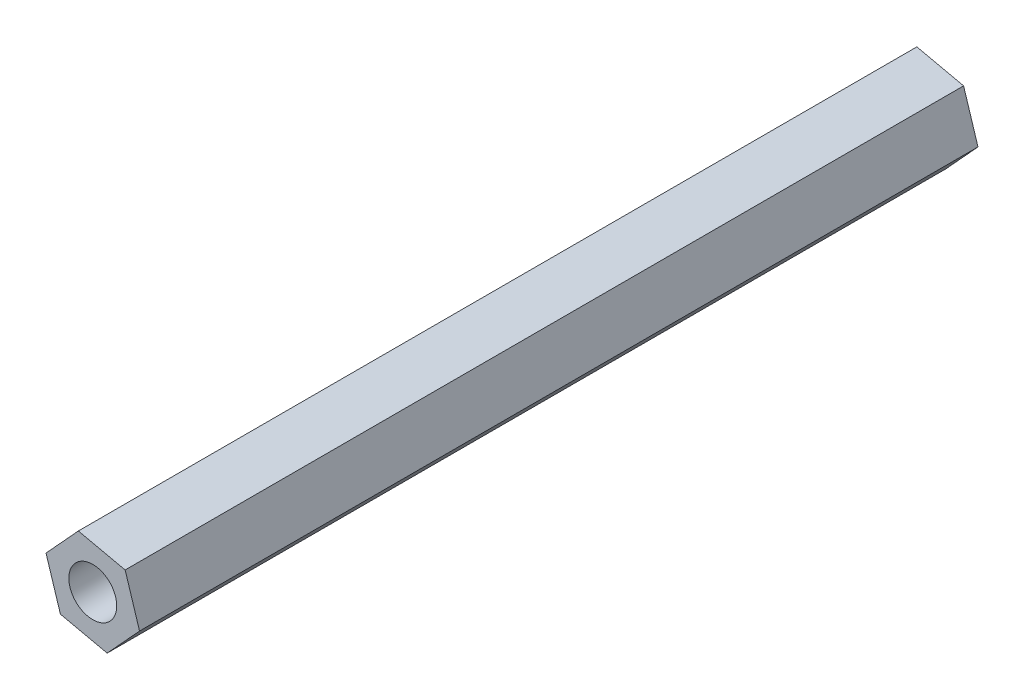
ISO-10303-21;
HEADER;
FILE_DESCRIPTION(('STEP AP214'),'2;1');
FILE_NAME('part.step','',(''),(''),'','','');
FILE_SCHEMA(('AUTOMOTIVE_DESIGN { 1 0 10303 214 1 1 1 1 }'));
ENDSEC;
DATA;
#1=APPLICATION_CONTEXT('core data for automotive mechanical design processes');
#2=APPLICATION_PROTOCOL_DEFINITION('international standard','automotive_design',2000,#1);
#3=PRODUCT_CONTEXT('',#1,'mechanical');
#4=PRODUCT('Part','Part','',(#3));
#5=PRODUCT_RELATED_PRODUCT_CATEGORY('part','',(#4));
#6=PRODUCT_DEFINITION_FORMATION('','',#4);
#7=PRODUCT_DEFINITION_CONTEXT('part definition',#1,'design');
#8=PRODUCT_DEFINITION('design','',#6,#7);
#9=PRODUCT_DEFINITION_SHAPE('','',#8);
#10=(LENGTH_UNIT() NAMED_UNIT(*) SI_UNIT(.MILLI.,.METRE.));
#11=(NAMED_UNIT(*) PLANE_ANGLE_UNIT() SI_UNIT($,.RADIAN.));
#12=(NAMED_UNIT(*) SI_UNIT($,.STERADIAN.) SOLID_ANGLE_UNIT());
#13=UNCERTAINTY_MEASURE_WITH_UNIT(LENGTH_MEASURE(1.E-05),#10,'distance_accuracy_value','');
#14=(GEOMETRIC_REPRESENTATION_CONTEXT(3) GLOBAL_UNCERTAINTY_ASSIGNED_CONTEXT((#13)) GLOBAL_UNIT_ASSIGNED_CONTEXT((#10,
#11,#12)) REPRESENTATION_CONTEXT('',''));
#15=CARTESIAN_POINT('',(0.,0.,0.));
#16=DIRECTION('',(0.,0.,1.));
#17=DIRECTION('',(1.,0.,0.));
#18=AXIS2_PLACEMENT_3D('',#15,#16,#17);
#19=CARTESIAN_POINT('',(0.,0.,70.));
#20=DIRECTION('',(0.,0.,1.));
#21=DIRECTION('',(1.,0.,0.));
#22=AXIS2_PLACEMENT_3D('',#19,#20,#21);
#23=PLANE('',#22);
#24=DIRECTION('',(-0.976282323244867,0.216501328678612,0.));
#25=VECTOR('',#24,1.);
#26=CARTESIAN_POINT('',(-150.297452748808,45.2139385154254,70.));
#27=LINE('',#26,#25);
#28=CARTESIAN_POINT('',(-150.297452748808,45.2139385154254,70.));
#29=VERTEX_POINT('',#28);
#30=CARTESIAN_POINT('',(-154.202582041788,46.0799438301398,70.));
#31=VERTEX_POINT('',#30);
#32=EDGE_CURVE('E143',#29,#31,#27,.T.);
#33=ORIENTED_EDGE('',*,*,#32,.T.);
#34=DIRECTION('',(-0.675636812211194,-0.737234628856442,0.));
#35=VECTOR('',#34,1.);
#36=CARTESIAN_POINT('',(-154.202582041788,46.0799438301398,70.));
#37=LINE('',#36,#35);
#38=CARTESIAN_POINT('',(-156.905129290632,43.1310053147141,70.));
#39=VERTEX_POINT('',#38);
#40=EDGE_CURVE('E101',#31,#39,#37,.T.);
#41=ORIENTED_EDGE('',*,*,#40,.T.);
#42=DIRECTION('',(0.300645511033671,-0.953735957535052,0.));
#43=VECTOR('',#42,1.);
#44=CARTESIAN_POINT('',(-156.905129290632,43.1310053147141,70.));
#45=LINE('',#44,#43);
#46=CARTESIAN_POINT('',(-155.702547246498,39.3160614845739,70.));
#47=VERTEX_POINT('',#46);
#48=EDGE_CURVE('E114',#39,#47,#45,.T.);
#49=ORIENTED_EDGE('',*,*,#48,.T.);
#50=DIRECTION('',(0.976282323244867,-0.216501328678614,0.));
#51=VECTOR('',#50,1.);
#52=CARTESIAN_POINT('',(-155.702547246498,39.3160614845739,70.));
#53=LINE('',#52,#51);
#54=CARTESIAN_POINT('',(-151.797417953518,38.4500561698594,70.));
#55=VERTEX_POINT('',#54);
#56=EDGE_CURVE('E108',#47,#55,#53,.T.);
#57=ORIENTED_EDGE('',*,*,#56,.T.);
#58=DIRECTION('',(0.675636812211199,0.737234628856438,0.));
#59=VECTOR('',#58,1.);
#60=CARTESIAN_POINT('',(-151.797417953518,38.4500561698594,70.));
#61=LINE('',#60,#59);
#62=CARTESIAN_POINT('',(-149.094870704673,41.3989946852852,70.));
#63=VERTEX_POINT('',#62);
#64=EDGE_CURVE('E112',#55,#63,#61,.T.);
#65=ORIENTED_EDGE('',*,*,#64,.T.);
#66=DIRECTION('',(-0.30064551103367,0.953735957535052,0.));
#67=VECTOR('',#66,1.);
#68=CARTESIAN_POINT('',(-149.094870704673,41.3989946852852,70.));
#69=LINE('',#68,#67);
#70=EDGE_CURVE('E64',#63,#29,#69,.T.);
#71=ORIENTED_EDGE('',*,*,#70,.T.);
#72=EDGE_LOOP('',(#33,#41,#49,#57,#65,#71));
#73=FACE_BOUND('',#72,.T.);
#74=CARTESIAN_POINT('',(-152.999999997653,42.2649999999996,70.));
#75=DIRECTION('',(0.,0.,1.));
#76=DIRECTION('',(1.,0.,0.));
#77=AXIS2_PLACEMENT_3D('',#74,#75,#76);
#78=CIRCLE('',#77,2.);
#79=CARTESIAN_POINT('',(-150.999999997653,42.2649999999996,70.));
#80=VERTEX_POINT('',#79);
#81=EDGE_CURVE('E136',#80,#80,#78,.T.);
#82=ORIENTED_EDGE('',*,*,#81,.F.);
#83=EDGE_LOOP('',(#82));
#84=FACE_BOUND('',#83,.T.);
#85=ADVANCED_FACE('F47',(#73,#84),#23,.T.);
#86=CARTESIAN_POINT('',(0.,0.,0.));
#87=DIRECTION('',(0.,0.,1.));
#88=DIRECTION('',(1.,0.,0.));
#89=AXIS2_PLACEMENT_3D('',#86,#87,#88);
#90=PLANE('',#89);
#91=DIRECTION('',(-0.976282323244867,0.216501328678612,0.));
#92=VECTOR('',#91,1.);
#93=CARTESIAN_POINT('',(-150.297452748808,45.2139385154254,0.));
#94=LINE('',#93,#92);
#95=CARTESIAN_POINT('',(-150.297452748808,45.2139385154254,0.));
#96=VERTEX_POINT('',#95);
#97=CARTESIAN_POINT('',(-154.202582041788,46.0799438301398,0.));
#98=VERTEX_POINT('',#97);
#99=EDGE_CURVE('E132',#96,#98,#94,.T.);
#100=ORIENTED_EDGE('',*,*,#99,.F.);
#101=DIRECTION('',(-0.30064551103367,0.953735957535052,0.));
#102=VECTOR('',#101,1.);
#103=CARTESIAN_POINT('',(-149.094870704673,41.3989946852852,0.));
#104=LINE('',#103,#102);
#105=CARTESIAN_POINT('',(-149.094870704673,41.3989946852852,0.));
#106=VERTEX_POINT('',#105);
#107=EDGE_CURVE('E93',#106,#96,#104,.T.);
#108=ORIENTED_EDGE('',*,*,#107,.F.);
#109=DIRECTION('',(0.675636812211199,0.737234628856438,0.));
#110=VECTOR('',#109,1.);
#111=CARTESIAN_POINT('',(-151.797417953518,38.4500561698594,0.));
#112=LINE('',#111,#110);
#113=CARTESIAN_POINT('',(-151.797417953518,38.4500561698594,0.));
#114=VERTEX_POINT('',#113);
#115=EDGE_CURVE('E87',#114,#106,#112,.T.);
#116=ORIENTED_EDGE('',*,*,#115,.F.);
#117=DIRECTION('',(0.976282323244867,-0.216501328678614,0.));
#118=VECTOR('',#117,1.);
#119=CARTESIAN_POINT('',(-155.702547246498,39.3160614845739,0.));
#120=LINE('',#119,#118);
#121=CARTESIAN_POINT('',(-155.702547246498,39.3160614845739,0.));
#122=VERTEX_POINT('',#121);
#123=EDGE_CURVE('E122',#122,#114,#120,.T.);
#124=ORIENTED_EDGE('',*,*,#123,.F.);
#125=DIRECTION('',(0.300645511033671,-0.953735957535052,0.));
#126=VECTOR('',#125,1.);
#127=CARTESIAN_POINT('',(-156.905129290632,43.1310053147141,0.));
#128=LINE('',#127,#126);
#129=CARTESIAN_POINT('',(-156.905129290632,43.1310053147141,0.));
#130=VERTEX_POINT('',#129);
#131=EDGE_CURVE('E138',#130,#122,#128,.T.);
#132=ORIENTED_EDGE('',*,*,#131,.F.);
#133=DIRECTION('',(-0.675636812211194,-0.737234628856442,0.));
#134=VECTOR('',#133,1.);
#135=CARTESIAN_POINT('',(-154.202582041788,46.0799438301398,0.));
#136=LINE('',#135,#134);
#137=EDGE_CURVE('E135',#98,#130,#136,.T.);
#138=ORIENTED_EDGE('',*,*,#137,.F.);
#139=EDGE_LOOP('',(#100,#108,#116,#124,#132,#138));
#140=FACE_BOUND('',#139,.T.);
#141=CARTESIAN_POINT('',(-152.999999997653,42.2649999999996,0.));
#142=DIRECTION('',(0.,0.,1.));
#143=DIRECTION('',(1.,0.,0.));
#144=AXIS2_PLACEMENT_3D('',#141,#142,#143);
#145=CIRCLE('',#144,2.);
#146=CARTESIAN_POINT('',(-150.999999997653,42.2649999999996,0.));
#147=VERTEX_POINT('',#146);
#148=EDGE_CURVE('E245',#147,#147,#145,.T.);
#149=ORIENTED_EDGE('',*,*,#148,.T.);
#150=EDGE_LOOP('',(#149));
#151=FACE_BOUND('',#150,.T.);
#152=ADVANCED_FACE('F152',(#140,#151),#90,.F.);
#153=CARTESIAN_POINT('',(-150.297452748808,45.2139385154254,70.));
#154=DIRECTION('',(-0.216501328678612,-0.976282323244867,0.));
#155=DIRECTION('',(0.976282323244867,-0.216501328678612,0.));
#156=AXIS2_PLACEMENT_3D('',#153,#154,#155);
#157=PLANE('',#156);
#158=ORIENTED_EDGE('',*,*,#99,.T.);
#159=DIRECTION('',(0.,0.,-1.));
#160=VECTOR('',#159,1.);
#161=CARTESIAN_POINT('',(-154.202582041788,46.0799438301398,70.));
#162=LINE('',#161,#160);
#163=EDGE_CURVE('E13',#31,#98,#162,.T.);
#164=ORIENTED_EDGE('',*,*,#163,.F.);
#165=ORIENTED_EDGE('',*,*,#32,.F.);
#166=DIRECTION('',(0.,0.,-1.));
#167=VECTOR('',#166,1.);
#168=CARTESIAN_POINT('',(-150.297452748808,45.2139385154254,70.));
#169=LINE('',#168,#167);
#170=EDGE_CURVE('E128',#29,#96,#169,.T.);
#171=ORIENTED_EDGE('',*,*,#170,.T.);
#172=EDGE_LOOP('',(#158,#164,#165,#171));
#173=FACE_BOUND('',#172,.T.);
#174=ADVANCED_FACE('F49',(#173),#157,.F.);
#175=CARTESIAN_POINT('',(-154.202582041788,46.0799438301398,70.));
#176=DIRECTION('',(0.737234628856442,-0.675636812211194,0.));
#177=DIRECTION('',(0.675636812211194,0.737234628856442,0.));
#178=AXIS2_PLACEMENT_3D('',#175,#176,#177);
#179=PLANE('',#178);
#180=ORIENTED_EDGE('',*,*,#137,.T.);
#181=DIRECTION('',(0.,0.,-1.));
#182=VECTOR('',#181,1.);
#183=CARTESIAN_POINT('',(-156.905129290632,43.1310053147141,70.));
#184=LINE('',#183,#182);
#185=EDGE_CURVE('E56',#39,#130,#184,.T.);
#186=ORIENTED_EDGE('',*,*,#185,.F.);
#187=ORIENTED_EDGE('',*,*,#40,.F.);
#188=ORIENTED_EDGE('',*,*,#163,.T.);
#189=EDGE_LOOP('',(#180,#186,#187,#188));
#190=FACE_BOUND('',#189,.T.);
#191=ADVANCED_FACE('F177',(#190),#179,.F.);
#192=CARTESIAN_POINT('',(-156.905129290632,43.1310053147141,70.));
#193=DIRECTION('',(0.953735957535052,0.300645511033671,0.));
#194=DIRECTION('',(-0.300645511033671,0.953735957535052,0.));
#195=AXIS2_PLACEMENT_3D('',#192,#193,#194);
#196=PLANE('',#195);
#197=ORIENTED_EDGE('',*,*,#131,.T.);
#198=DIRECTION('',(0.,0.,-1.));
#199=VECTOR('',#198,1.);
#200=CARTESIAN_POINT('',(-155.702547246498,39.3160614845739,70.));
#201=LINE('',#200,#199);
#202=EDGE_CURVE('E123',#47,#122,#201,.T.);
#203=ORIENTED_EDGE('',*,*,#202,.F.);
#204=ORIENTED_EDGE('',*,*,#48,.F.);
#205=ORIENTED_EDGE('',*,*,#185,.T.);
#206=EDGE_LOOP('',(#197,#203,#204,#205));
#207=FACE_BOUND('',#206,.T.);
#208=ADVANCED_FACE('F149',(#207),#196,.F.);
#209=CARTESIAN_POINT('',(-155.702547246498,39.3160614845739,70.));
#210=DIRECTION('',(0.216501328678614,0.976282323244867,0.));
#211=DIRECTION('',(-0.976282323244867,0.216501328678614,0.));
#212=AXIS2_PLACEMENT_3D('',#209,#210,#211);
#213=PLANE('',#212);
#214=ORIENTED_EDGE('',*,*,#123,.T.);
#215=DIRECTION('',(0.,0.,-1.));
#216=VECTOR('',#215,1.);
#217=CARTESIAN_POINT('',(-151.797417953518,38.4500561698594,70.));
#218=LINE('',#217,#216);
#219=EDGE_CURVE('E119',#55,#114,#218,.T.);
#220=ORIENTED_EDGE('',*,*,#219,.F.);
#221=ORIENTED_EDGE('',*,*,#56,.F.);
#222=ORIENTED_EDGE('',*,*,#202,.T.);
#223=EDGE_LOOP('',(#214,#220,#221,#222));
#224=FACE_BOUND('',#223,.T.);
#225=ADVANCED_FACE('F120',(#224),#213,.F.);
#226=CARTESIAN_POINT('',(-151.797417953518,38.4500561698594,70.));
#227=DIRECTION('',(-0.737234628856438,0.675636812211199,0.));
#228=DIRECTION('',(-0.675636812211199,-0.737234628856438,0.));
#229=AXIS2_PLACEMENT_3D('',#226,#227,#228);
#230=PLANE('',#229);
#231=ORIENTED_EDGE('',*,*,#115,.T.);
#232=DIRECTION('',(0.,0.,-1.));
#233=VECTOR('',#232,1.);
#234=CARTESIAN_POINT('',(-149.094870704673,41.3989946852852,70.));
#235=LINE('',#234,#233);
#236=EDGE_CURVE('E124',#63,#106,#235,.T.);
#237=ORIENTED_EDGE('',*,*,#236,.F.);
#238=ORIENTED_EDGE('',*,*,#64,.F.);
#239=ORIENTED_EDGE('',*,*,#219,.T.);
#240=EDGE_LOOP('',(#231,#237,#238,#239));
#241=FACE_BOUND('',#240,.T.);
#242=ADVANCED_FACE('F126',(#241),#230,.F.);
#243=CARTESIAN_POINT('',(-149.094870704673,41.3989946852852,70.));
#244=DIRECTION('',(-0.953735957535052,-0.30064551103367,0.));
#245=DIRECTION('',(0.30064551103367,-0.953735957535053,0.));
#246=AXIS2_PLACEMENT_3D('',#243,#244,#245);
#247=PLANE('',#246);
#248=ORIENTED_EDGE('',*,*,#107,.T.);
#249=ORIENTED_EDGE('',*,*,#170,.F.);
#250=ORIENTED_EDGE('',*,*,#70,.F.);
#251=ORIENTED_EDGE('',*,*,#236,.T.);
#252=EDGE_LOOP('',(#248,#249,#250,#251));
#253=FACE_BOUND('',#252,.T.);
#254=ADVANCED_FACE('F157',(#253),#247,.F.);
#255=CARTESIAN_POINT('',(-152.999999997653,42.2649999999996,70.));
#256=DIRECTION('',(0.,0.,-1.));
#257=DIRECTION('',(-1.,0.,0.));
#258=AXIS2_PLACEMENT_3D('',#255,#256,#257);
#259=CYLINDRICAL_SURFACE('',#258,2.);
#260=ORIENTED_EDGE('',*,*,#81,.T.);
#261=EDGE_LOOP('',(#260));
#262=FACE_BOUND('',#261,.T.);
#263=ORIENTED_EDGE('',*,*,#148,.F.);
#264=EDGE_LOOP('',(#263));
#265=FACE_BOUND('',#264,.T.);
#266=ADVANCED_FACE('F159',(#262,#265),#259,.F.);
#267=CLOSED_SHELL('',(#85,#152,#174,#191,#208,#225,#242,#254,#266));
#268=MANIFOLD_SOLID_BREP('B2',#267);
#269=ADVANCED_BREP_SHAPE_REPRESENTATION('',(#18,#268),#14);
#270=SHAPE_DEFINITION_REPRESENTATION(#9,#269);
ENDSEC;
END-ISO-10303-21;
